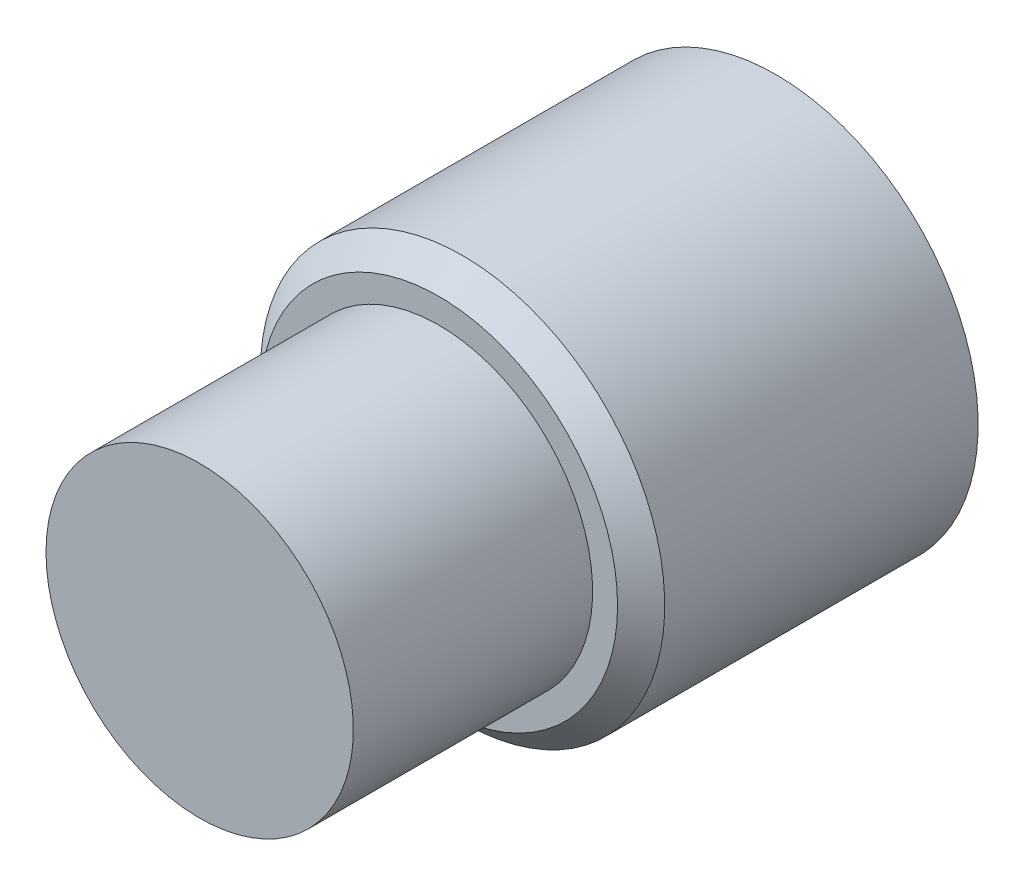
ISO-10303-21;
HEADER;
FILE_DESCRIPTION(('STEP AP214'),'2;1');
FILE_NAME('part.step','',(''),(''),'','','');
FILE_SCHEMA(('AUTOMOTIVE_DESIGN { 1 0 10303 214 1 1 1 1 }'));
ENDSEC;
DATA;
#1=APPLICATION_CONTEXT('core data for automotive mechanical design processes');
#2=APPLICATION_PROTOCOL_DEFINITION('international standard','automotive_design',2000,#1);
#3=PRODUCT_CONTEXT('',#1,'mechanical');
#4=PRODUCT('Part','Part','',(#3));
#5=PRODUCT_RELATED_PRODUCT_CATEGORY('part','',(#4));
#6=PRODUCT_DEFINITION_FORMATION('','',#4);
#7=PRODUCT_DEFINITION_CONTEXT('part definition',#1,'design');
#8=PRODUCT_DEFINITION('design','',#6,#7);
#9=PRODUCT_DEFINITION_SHAPE('','',#8);
#10=(LENGTH_UNIT() NAMED_UNIT(*) SI_UNIT(.MILLI.,.METRE.));
#11=(NAMED_UNIT(*) PLANE_ANGLE_UNIT() SI_UNIT($,.RADIAN.));
#12=(NAMED_UNIT(*) SI_UNIT($,.STERADIAN.) SOLID_ANGLE_UNIT());
#13=UNCERTAINTY_MEASURE_WITH_UNIT(LENGTH_MEASURE(1.E-05),#10,'distance_accuracy_value','');
#14=(GEOMETRIC_REPRESENTATION_CONTEXT(3) GLOBAL_UNCERTAINTY_ASSIGNED_CONTEXT((#13)) GLOBAL_UNIT_ASSIGNED_CONTEXT((#10,
#11,#12)) REPRESENTATION_CONTEXT('',''));
#15=CARTESIAN_POINT('',(0.,0.,0.));
#16=DIRECTION('',(0.,0.,1.));
#17=DIRECTION('',(1.,0.,0.));
#18=AXIS2_PLACEMENT_3D('',#15,#16,#17);
#19=CARTESIAN_POINT('',(0.,0.,8.55));
#20=DIRECTION('',(0.,0.,1.));
#21=DIRECTION('',(1.,0.,0.));
#22=AXIS2_PLACEMENT_3D('',#19,#20,#21);
#23=PLANE('',#22);
#24=CARTESIAN_POINT('',(0.,0.,8.55));
#25=DIRECTION('',(0.,0.,-1.));
#26=DIRECTION('',(-1.,0.,0.));
#27=AXIS2_PLACEMENT_3D('',#24,#25,#26);
#28=CIRCLE('',#27,2.28);
#29=CARTESIAN_POINT('',(-2.28,0.,8.55));
#30=VERTEX_POINT('',#29);
#31=EDGE_CURVE('E41',#30,#30,#28,.T.);
#32=ORIENTED_EDGE('',*,*,#31,.F.);
#33=EDGE_LOOP('',(#32));
#34=FACE_BOUND('',#33,.T.);
#35=ADVANCED_FACE('F15',(#34),#23,.T.);
#36=CARTESIAN_POINT('',(0.,0.,9.));
#37=DIRECTION('',(0.,0.,-1.));
#38=DIRECTION('',(-1.,0.,0.));
#39=AXIS2_PLACEMENT_3D('',#36,#37,#38);
#40=CYLINDRICAL_SURFACE('',#39,2.28);
#41=ORIENTED_EDGE('',*,*,#31,.T.);
#42=EDGE_LOOP('',(#41));
#43=FACE_BOUND('',#42,.T.);
#44=CARTESIAN_POINT('',(0.,0.,5.));
#45=DIRECTION('',(0.,0.,-1.));
#46=DIRECTION('',(-1.,0.,0.));
#47=AXIS2_PLACEMENT_3D('',#44,#45,#46);
#48=CIRCLE('',#47,2.28);
#49=CARTESIAN_POINT('',(-2.28,0.,5.));
#50=VERTEX_POINT('',#49);
#51=EDGE_CURVE('E36',#50,#50,#48,.F.);
#52=ORIENTED_EDGE('',*,*,#51,.T.);
#53=EDGE_LOOP('',(#52));
#54=FACE_BOUND('',#53,.T.);
#55=ADVANCED_FACE('F46',(#43,#54),#40,.T.);
#56=CARTESIAN_POINT('',(0.,0.,5.));
#57=DIRECTION('',(0.,0.,-1.));
#58=DIRECTION('',(-1.,0.,0.));
#59=AXIS2_PLACEMENT_3D('',#56,#57,#58);
#60=PLANE('',#59);
#61=ORIENTED_EDGE('',*,*,#51,.F.);
#62=EDGE_LOOP('',(#61));
#63=FACE_BOUND('',#62,.T.);
#64=CARTESIAN_POINT('',(0.,0.,4.99999999999545));
#65=DIRECTION('',(0.,0.,-1.));
#66=DIRECTION('',(-1.,0.,0.));
#67=AXIS2_PLACEMENT_3D('',#64,#65,#66);
#68=CIRCLE('',#67,2.65000000001692);
#69=CARTESIAN_POINT('',(-2.65000000001692,0.,4.99999999999545));
#70=VERTEX_POINT('',#69);
#71=EDGE_CURVE('E27',#70,#70,#68,.T.);
#72=ORIENTED_EDGE('',*,*,#71,.F.);
#73=EDGE_LOOP('',(#72));
#74=FACE_BOUND('',#73,.T.);
#75=ADVANCED_FACE('F54',(#63,#74),#60,.F.);
#76=CARTESIAN_POINT('',(0.,0.,4.65000000014015));
#77=DIRECTION('',(0.,0.,-1.));
#78=DIRECTION('',(-1.,0.,0.));
#79=AXIS2_PLACEMENT_3D('',#76,#77,#78);
#80=CONICAL_SURFACE('',#79,2.99999999987222,0.785398163397448);
#81=CARTESIAN_POINT('',(0.,0.,4.65));
#82=DIRECTION('',(0.,0.,-1.));
#83=DIRECTION('',(-1.,0.,0.));
#84=AXIS2_PLACEMENT_3D('',#81,#82,#83);
#85=CIRCLE('',#84,3.);
#86=CARTESIAN_POINT('',(-3.,0.,4.65));
#87=VERTEX_POINT('',#86);
#88=EDGE_CURVE('E22',#87,#87,#85,.T.);
#89=ORIENTED_EDGE('',*,*,#88,.F.);
#90=EDGE_LOOP('',(#89));
#91=FACE_BOUND('',#90,.T.);
#92=ORIENTED_EDGE('',*,*,#71,.T.);
#93=EDGE_LOOP('',(#92));
#94=FACE_BOUND('',#93,.T.);
#95=ADVANCED_FACE('F62',(#91,#94),#80,.T.);
#96=CARTESIAN_POINT('',(0.,0.,0.));
#97=DIRECTION('',(0.,0.,1.));
#98=DIRECTION('',(1.,0.,0.));
#99=AXIS2_PLACEMENT_3D('',#96,#97,#98);
#100=PLANE('',#99);
#101=CARTESIAN_POINT('',(0.,0.,0.));
#102=DIRECTION('',(0.,0.,-1.));
#103=DIRECTION('',(-1.,0.,0.));
#104=AXIS2_PLACEMENT_3D('',#101,#102,#103);
#105=CIRCLE('',#104,3.);
#106=CARTESIAN_POINT('',(-3.,0.,0.));
#107=VERTEX_POINT('',#106);
#108=EDGE_CURVE('E10',#107,#107,#105,.F.);
#109=ORIENTED_EDGE('',*,*,#108,.F.);
#110=EDGE_LOOP('',(#109));
#111=FACE_BOUND('',#110,.T.);
#112=ADVANCED_FACE('F57',(#111),#100,.F.);
#113=CARTESIAN_POINT('',(0.,0.,5.));
#114=DIRECTION('',(0.,0.,-1.));
#115=DIRECTION('',(-1.,0.,0.));
#116=AXIS2_PLACEMENT_3D('',#113,#114,#115);
#117=CYLINDRICAL_SURFACE('',#116,3.);
#118=ORIENTED_EDGE('',*,*,#108,.T.);
#119=EDGE_LOOP('',(#118));
#120=FACE_BOUND('',#119,.T.);
#121=ORIENTED_EDGE('',*,*,#88,.T.);
#122=EDGE_LOOP('',(#121));
#123=FACE_BOUND('',#122,.T.);
#124=ADVANCED_FACE('F55',(#120,#123),#117,.T.);
#125=CLOSED_SHELL('',(#35,#55,#75,#95,#112,#124));
#126=MANIFOLD_SOLID_BREP('B1',#125);
#127=ADVANCED_BREP_SHAPE_REPRESENTATION('',(#18,#126),#14);
#128=SHAPE_DEFINITION_REPRESENTATION(#9,#127);
ENDSEC;
END-ISO-10303-21;
